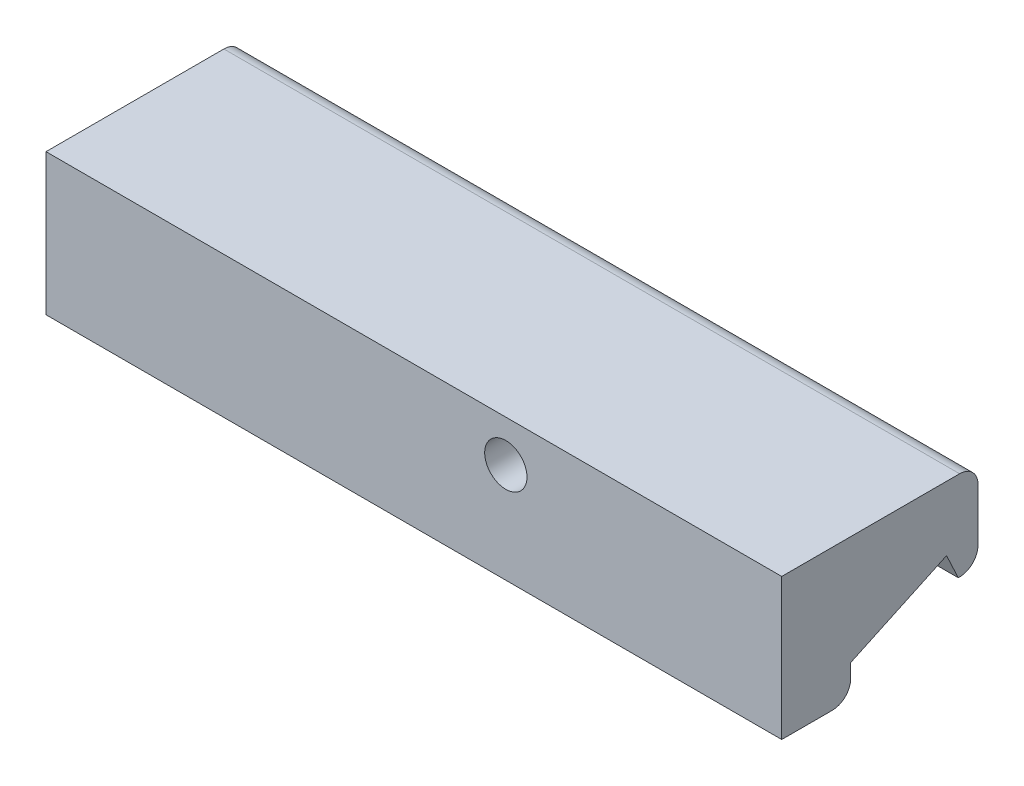
ISO-10303-21;
HEADER;
FILE_DESCRIPTION(('STEP AP214'),'2;1');
FILE_NAME('part.step','',(''),(''),'','','');
FILE_SCHEMA(('AUTOMOTIVE_DESIGN { 1 0 10303 214 1 1 1 1 }'));
ENDSEC;
DATA;
#1=APPLICATION_CONTEXT('core data for automotive mechanical design processes');
#2=APPLICATION_PROTOCOL_DEFINITION('international standard','automotive_design',2000,#1);
#3=PRODUCT_CONTEXT('',#1,'mechanical');
#4=PRODUCT('Part','Part','',(#3));
#5=PRODUCT_RELATED_PRODUCT_CATEGORY('part','',(#4));
#6=PRODUCT_DEFINITION_FORMATION('','',#4);
#7=PRODUCT_DEFINITION_CONTEXT('part definition',#1,'design');
#8=PRODUCT_DEFINITION('design','',#6,#7);
#9=PRODUCT_DEFINITION_SHAPE('','',#8);
#10=(LENGTH_UNIT() NAMED_UNIT(*) SI_UNIT(.MILLI.,.METRE.));
#11=(NAMED_UNIT(*) PLANE_ANGLE_UNIT() SI_UNIT($,.RADIAN.));
#12=(NAMED_UNIT(*) SI_UNIT($,.STERADIAN.) SOLID_ANGLE_UNIT());
#13=UNCERTAINTY_MEASURE_WITH_UNIT(LENGTH_MEASURE(1.E-05),#10,'distance_accuracy_value','');
#14=(GEOMETRIC_REPRESENTATION_CONTEXT(3) GLOBAL_UNCERTAINTY_ASSIGNED_CONTEXT((#13)) GLOBAL_UNIT_ASSIGNED_CONTEXT((#10,
#11,#12)) REPRESENTATION_CONTEXT('',''));
#15=CARTESIAN_POINT('',(0.,0.,0.));
#16=DIRECTION('',(0.,0.,1.));
#17=DIRECTION('',(1.,0.,0.));
#18=AXIS2_PLACEMENT_3D('',#15,#16,#17);
#19=CARTESIAN_POINT('',(80.,15.360110010018,0.));
#20=DIRECTION('',(0.,0.,-1.));
#21=DIRECTION('',(0.,1.,0.));
#22=AXIS2_PLACEMENT_3D('',#19,#20,#21);
#23=PLANE('',#22);
#24=CARTESIAN_POINT('',(50.,10.860110010018,0.));
#25=DIRECTION('',(0.,0.,1.));
#26=DIRECTION('',(1.,0.,0.));
#27=AXIS2_PLACEMENT_3D('',#24,#25,#26);
#28=CIRCLE('',#27,2.3);
#29=CARTESIAN_POINT('',(52.3,10.860110010018,0.));
#30=VERTEX_POINT('',#29);
#31=EDGE_CURVE('E296',#30,#30,#28,.T.);
#32=ORIENTED_EDGE('',*,*,#31,.F.);
#33=EDGE_LOOP('',(#32));
#34=FACE_BOUND('',#33,.T.);
#35=DIRECTION('',(0.,-1.,0.));
#36=VECTOR('',#35,1.);
#37=CARTESIAN_POINT('',(0.,15.360110010018,0.));
#38=LINE('',#37,#36);
#39=CARTESIAN_POINT('',(0.,15.360110010018,0.));
#40=VERTEX_POINT('',#39);
#41=CARTESIAN_POINT('',(0.,0.,0.));
#42=VERTEX_POINT('',#41);
#43=EDGE_CURVE('E153',#40,#42,#38,.T.);
#44=ORIENTED_EDGE('',*,*,#43,.T.);
#45=DIRECTION('',(-1.,0.,0.));
#46=VECTOR('',#45,1.);
#47=CARTESIAN_POINT('',(80.,0.,0.));
#48=LINE('',#47,#46);
#49=CARTESIAN_POINT('',(80.,0.,0.));
#50=VERTEX_POINT('',#49);
#51=EDGE_CURVE('E11',#50,#42,#48,.T.);
#52=ORIENTED_EDGE('',*,*,#51,.F.);
#53=DIRECTION('',(0.,-1.,0.));
#54=VECTOR('',#53,1.);
#55=CARTESIAN_POINT('',(80.,15.360110010018,0.));
#56=LINE('',#55,#54);
#57=CARTESIAN_POINT('',(80.,15.360110010018,0.));
#58=VERTEX_POINT('',#57);
#59=EDGE_CURVE('E172',#58,#50,#56,.T.);
#60=ORIENTED_EDGE('',*,*,#59,.F.);
#61=DIRECTION('',(-1.,0.,0.));
#62=VECTOR('',#61,1.);
#63=CARTESIAN_POINT('',(80.,15.360110010018,0.));
#64=LINE('',#63,#62);
#65=EDGE_CURVE('E149',#58,#40,#64,.T.);
#66=ORIENTED_EDGE('',*,*,#65,.T.);
#67=EDGE_LOOP('',(#44,#52,#60,#66));
#68=FACE_BOUND('',#67,.T.);
#69=ADVANCED_FACE('F39',(#34,#68),#23,.F.);
#70=CARTESIAN_POINT('',(80.,0.,0.));
#71=DIRECTION('',(0.,1.,0.));
#72=DIRECTION('',(0.,0.,1.));
#73=AXIS2_PLACEMENT_3D('',#70,#71,#72);
#74=PLANE('',#73);
#75=DIRECTION('',(0.,0.,-1.));
#76=VECTOR('',#75,1.);
#77=CARTESIAN_POINT('',(0.,0.,0.));
#78=LINE('',#77,#76);
#79=CARTESIAN_POINT('',(0.,0.,-5.4994615533352));
#80=VERTEX_POINT('',#79);
#81=EDGE_CURVE('E156',#42,#80,#78,.T.);
#82=ORIENTED_EDGE('',*,*,#81,.T.);
#83=DIRECTION('',(-1.,0.,0.));
#84=VECTOR('',#83,1.);
#85=CARTESIAN_POINT('',(80.,0.,-5.4994615533352));
#86=LINE('',#85,#84);
#87=CARTESIAN_POINT('',(80.,0.,-5.4994615533352));
#88=VERTEX_POINT('',#87);
#89=EDGE_CURVE('E46',#88,#80,#86,.T.);
#90=ORIENTED_EDGE('',*,*,#89,.F.);
#91=DIRECTION('',(0.,0.,-1.));
#92=VECTOR('',#91,1.);
#93=CARTESIAN_POINT('',(80.,0.,0.));
#94=LINE('',#93,#92);
#95=EDGE_CURVE('E103',#50,#88,#94,.T.);
#96=ORIENTED_EDGE('',*,*,#95,.F.);
#97=ORIENTED_EDGE('',*,*,#51,.T.);
#98=EDGE_LOOP('',(#82,#90,#96,#97));
#99=FACE_BOUND('',#98,.T.);
#100=ADVANCED_FACE('F287',(#99),#74,.F.);
#101=CARTESIAN_POINT('',(80.,2.0005384466648,-5.4994615533352));
#102=DIRECTION('',(-1.,0.,0.));
#103=DIRECTION('',(0.,0.,1.));
#104=AXIS2_PLACEMENT_3D('',#101,#102,#103);
#105=CYLINDRICAL_SURFACE('',#104,2.0005384466648);
#106=CARTESIAN_POINT('',(0.,2.0005384466648,-5.4994615533352));
#107=DIRECTION('',(1.,0.,0.));
#108=DIRECTION('',(0.,0.,-1.));
#109=AXIS2_PLACEMENT_3D('',#106,#107,#108);
#110=CIRCLE('',#109,2.0005384466648);
#111=CARTESIAN_POINT('',(0.,2.0005384466648,-7.5));
#112=VERTEX_POINT('',#111);
#113=EDGE_CURVE('E159',#80,#112,#110,.T.);
#114=ORIENTED_EDGE('',*,*,#113,.T.);
#115=DIRECTION('',(-1.,0.,0.));
#116=VECTOR('',#115,1.);
#117=CARTESIAN_POINT('',(80.,2.0005384466648,-7.5));
#118=LINE('',#117,#116);
#119=CARTESIAN_POINT('',(80.,2.0005384466648,-7.5));
#120=VERTEX_POINT('',#119);
#121=EDGE_CURVE('E185',#120,#112,#118,.T.);
#122=ORIENTED_EDGE('',*,*,#121,.F.);
#123=CARTESIAN_POINT('',(80.,2.0005384466648,-5.4994615533352));
#124=DIRECTION('',(1.,0.,0.));
#125=DIRECTION('',(0.,0.,-1.));
#126=AXIS2_PLACEMENT_3D('',#123,#124,#125);
#127=CIRCLE('',#126,2.0005384466648);
#128=EDGE_CURVE('E193',#88,#120,#127,.T.);
#129=ORIENTED_EDGE('',*,*,#128,.F.);
#130=ORIENTED_EDGE('',*,*,#89,.T.);
#131=EDGE_LOOP('',(#114,#122,#129,#130));
#132=FACE_BOUND('',#131,.T.);
#133=ADVANCED_FACE('F191',(#132),#105,.T.);
#134=CARTESIAN_POINT('',(80.,3.5,-7.5));
#135=DIRECTION('',(0.,0.,1.));
#136=DIRECTION('',(0.,-1.,0.));
#137=AXIS2_PLACEMENT_3D('',#134,#135,#136);
#138=PLANE('',#137);
#139=DIRECTION('',(0.,1.,0.));
#140=VECTOR('',#139,1.);
#141=CARTESIAN_POINT('',(0.,3.5,-7.5));
#142=LINE('',#141,#140);
#143=CARTESIAN_POINT('',(0.,3.5,-7.5));
#144=VERTEX_POINT('',#143);
#145=EDGE_CURVE('E161',#112,#144,#142,.T.);
#146=ORIENTED_EDGE('',*,*,#145,.T.);
#147=DIRECTION('',(-1.,0.,0.));
#148=VECTOR('',#147,1.);
#149=CARTESIAN_POINT('',(0.,3.5,-7.5));
#150=LINE('',#149,#148);
#151=CARTESIAN_POINT('',(28.,3.5,-7.5));
#152=VERTEX_POINT('',#151);
#153=EDGE_CURVE('E207',#152,#144,#150,.T.);
#154=ORIENTED_EDGE('',*,*,#153,.F.);
#155=DIRECTION('',(-1.,0.,0.));
#156=VECTOR('',#155,1.);
#157=CARTESIAN_POINT('',(80.,3.5,-7.5));
#158=LINE('',#157,#156);
#159=CARTESIAN_POINT('',(80.,3.5,-7.5));
#160=VERTEX_POINT('',#159);
#161=EDGE_CURVE('E182',#160,#152,#158,.T.);
#162=ORIENTED_EDGE('',*,*,#161,.F.);
#163=DIRECTION('',(0.,1.,0.));
#164=VECTOR('',#163,1.);
#165=CARTESIAN_POINT('',(80.,3.5,-7.5));
#166=LINE('',#165,#164);
#167=EDGE_CURVE('E260',#120,#160,#166,.T.);
#168=ORIENTED_EDGE('',*,*,#167,.F.);
#169=ORIENTED_EDGE('',*,*,#121,.T.);
#170=EDGE_LOOP('',(#146,#154,#162,#168,#169));
#171=FACE_BOUND('',#170,.T.);
#172=ADVANCED_FACE('F203',(#171),#138,.F.);
#173=CARTESIAN_POINT('',(80.,8.36011001001802,-17.9225395509215));
#174=DIRECTION('',(0.,0.906307787036651,0.422618261740697));
#175=DIRECTION('',(0.,-0.422618261740697,0.906307787036651));
#176=AXIS2_PLACEMENT_3D('',#173,#174,#175);
#177=PLANE('',#176);
#178=CARTESIAN_POINT('',(36.15,5.93005500500901,-12.7112697754607));
#179=DIRECTION('',(0.,-0.906307787036651,-0.422618261740697));
#180=DIRECTION('',(0.,0.422618261740697,-0.906307787036651));
#181=AXIS2_PLACEMENT_3D('',#178,#179,#180);
#182=CIRCLE('',#181,2.30000000000001);
#183=CARTESIAN_POINT('',(36.15,6.90207700701262,-14.7957776856451));
#184=VERTEX_POINT('',#183);
#185=EDGE_CURVE('E251',#184,#184,#182,.T.);
#186=ORIENTED_EDGE('',*,*,#185,.F.);
#187=EDGE_LOOP('',(#186));
#188=FACE_BOUND('',#187,.T.);
#189=ORIENTED_EDGE('',*,*,#161,.T.);
#190=DIRECTION('',(0.,-0.422618261740697,0.906307787036651));
#191=VECTOR('',#190,1.);
#192=CARTESIAN_POINT('',(28.,3.5,-7.5));
#193=LINE('',#192,#191);
#194=CARTESIAN_POINT('',(28.,8.36011001001802,-17.9225395509215));
#195=VERTEX_POINT('',#194);
#196=EDGE_CURVE('E246',#195,#152,#193,.T.);
#197=ORIENTED_EDGE('',*,*,#196,.F.);
#198=DIRECTION('',(-1.,0.,0.));
#199=VECTOR('',#198,1.);
#200=CARTESIAN_POINT('',(80.,8.36011001001802,-17.9225395509215));
#201=LINE('',#200,#199);
#202=CARTESIAN_POINT('',(80.,8.36011001001802,-17.9225395509215));
#203=VERTEX_POINT('',#202);
#204=EDGE_CURVE('E179',#203,#195,#201,.T.);
#205=ORIENTED_EDGE('',*,*,#204,.F.);
#206=DIRECTION('',(0.,0.422618261740697,-0.906307787036651));
#207=VECTOR('',#206,1.);
#208=CARTESIAN_POINT('',(80.,8.36011001001802,-17.9225395509215));
#209=LINE('',#208,#207);
#210=EDGE_CURVE('E262',#160,#203,#209,.T.);
#211=ORIENTED_EDGE('',*,*,#210,.F.);
#212=EDGE_LOOP('',(#189,#197,#205,#211));
#213=FACE_BOUND('',#212,.T.);
#214=ADVANCED_FACE('F275',(#188,#213),#177,.F.);
#215=CARTESIAN_POINT('',(80.,5.64118664890806,-19.1903943361436));
#216=DIRECTION('',(0.,0.422618261740697,-0.906307787036651));
#217=DIRECTION('',(0.,0.906307787036651,0.422618261740697));
#218=AXIS2_PLACEMENT_3D('',#215,#216,#217);
#219=PLANE('',#218);
#220=DIRECTION('',(0.,-0.906307787036651,-0.422618261740697));
#221=VECTOR('',#220,1.);
#222=CARTESIAN_POINT('',(0.,5.64118664890806,-19.1903943361436));
#223=LINE('',#222,#221);
#224=CARTESIAN_POINT('',(0.,14.2511106257563,-15.175520849607));
#225=VERTEX_POINT('',#224);
#226=CARTESIAN_POINT('',(0.,5.64118664890806,-19.1903943361436));
#227=VERTEX_POINT('',#226);
#228=EDGE_CURVE('E164',#225,#227,#223,.T.);
#229=ORIENTED_EDGE('',*,*,#228,.T.);
#230=DIRECTION('',(-1.,0.,0.));
#231=VECTOR('',#230,1.);
#232=CARTESIAN_POINT('',(80.,5.64118664890806,-19.1903943361436));
#233=LINE('',#232,#231);
#234=CARTESIAN_POINT('',(80.,5.64118664890806,-19.1903943361436));
#235=VERTEX_POINT('',#234);
#236=EDGE_CURVE('E176',#235,#227,#233,.T.);
#237=ORIENTED_EDGE('',*,*,#236,.F.);
#238=DIRECTION('',(0.,-0.906307787036651,-0.422618261740697));
#239=VECTOR('',#238,1.);
#240=CARTESIAN_POINT('',(80.,5.64118664890806,-19.1903943361436));
#241=LINE('',#240,#239);
#242=EDGE_CURVE('E264',#203,#235,#241,.T.);
#243=ORIENTED_EDGE('',*,*,#242,.F.);
#244=ORIENTED_EDGE('',*,*,#204,.T.);
#245=DIRECTION('',(0.,-0.906307787036651,-0.422618261740697));
#246=VECTOR('',#245,1.);
#247=CARTESIAN_POINT('',(28.,14.2511106257563,-15.175520849607));
#248=LINE('',#247,#246);
#249=CARTESIAN_POINT('',(28.,14.2511106257563,-15.175520849607));
#250=VERTEX_POINT('',#249);
#251=EDGE_CURVE('E226',#250,#195,#248,.T.);
#252=ORIENTED_EDGE('',*,*,#251,.F.);
#253=DIRECTION('',(1.,0.,0.));
#254=VECTOR('',#253,1.);
#255=CARTESIAN_POINT('',(0.,14.2511106257563,-15.175520849607));
#256=LINE('',#255,#254);
#257=EDGE_CURVE('E230',#225,#250,#256,.T.);
#258=ORIENTED_EDGE('',*,*,#257,.F.);
#259=EDGE_LOOP('',(#229,#237,#243,#244,#252,#258));
#260=FACE_BOUND('',#259,.T.);
#261=ADVANCED_FACE('F228',(#260),#219,.F.);
#262=CARTESIAN_POINT('',(80.,7.63552847711335,-19.3407295358501));
#263=DIRECTION('',(-1.,0.,0.));
#264=DIRECTION('',(0.,0.,1.));
#265=AXIS2_PLACEMENT_3D('',#262,#263,#264);
#266=CYLINDRICAL_SURFACE('',#265,2.);
#267=CARTESIAN_POINT('',(0.,7.63552847711335,-19.3407295358501));
#268=DIRECTION('',(1.,0.,0.));
#269=DIRECTION('',(0.,0.,-1.));
#270=AXIS2_PLACEMENT_3D('',#267,#268,#269);
#271=CIRCLE('',#270,2.);
#272=CARTESIAN_POINT('',(0.,7.63552847711335,-21.3407295358501));
#273=VERTEX_POINT('',#272);
#274=EDGE_CURVE('E166',#227,#273,#271,.T.);
#275=ORIENTED_EDGE('',*,*,#274,.T.);
#276=DIRECTION('',(-1.,0.,0.));
#277=VECTOR('',#276,1.);
#278=CARTESIAN_POINT('',(80.,7.63552847711335,-21.3407295358501));
#279=LINE('',#278,#277);
#280=CARTESIAN_POINT('',(80.,7.63552847711335,-21.3407295358501));
#281=VERTEX_POINT('',#280);
#282=EDGE_CURVE('E144',#281,#273,#279,.T.);
#283=ORIENTED_EDGE('',*,*,#282,.F.);
#284=CARTESIAN_POINT('',(80.,7.63552847711335,-19.3407295358501));
#285=DIRECTION('',(1.,0.,0.));
#286=DIRECTION('',(0.,0.,-1.));
#287=AXIS2_PLACEMENT_3D('',#284,#285,#286);
#288=CIRCLE('',#287,2.);
#289=EDGE_CURVE('E132',#235,#281,#288,.T.);
#290=ORIENTED_EDGE('',*,*,#289,.F.);
#291=ORIENTED_EDGE('',*,*,#236,.T.);
#292=EDGE_LOOP('',(#275,#283,#290,#291));
#293=FACE_BOUND('',#292,.T.);
#294=ADVANCED_FACE('F269',(#293),#266,.T.);
#295=CARTESIAN_POINT('',(80.,7.63552847711335,-21.3407295358501));
#296=DIRECTION('',(0.,0.,1.));
#297=DIRECTION('',(1.,0.,0.));
#298=AXIS2_PLACEMENT_3D('',#295,#296,#297);
#299=PLANE('',#298);
#300=DIRECTION('',(0.,1.,0.));
#301=VECTOR('',#300,1.);
#302=CARTESIAN_POINT('',(0.,7.63552847711335,-21.3407295358501));
#303=LINE('',#302,#301);
#304=CARTESIAN_POINT('',(0.,13.360110010018,-21.3407295358501));
#305=VERTEX_POINT('',#304);
#306=EDGE_CURVE('E141',#273,#305,#303,.T.);
#307=ORIENTED_EDGE('',*,*,#306,.T.);
#308=DIRECTION('',(-1.,0.,0.));
#309=VECTOR('',#308,1.);
#310=CARTESIAN_POINT('',(80.,13.360110010018,-21.3407295358501));
#311=LINE('',#310,#309);
#312=CARTESIAN_POINT('',(80.,13.360110010018,-21.3407295358501));
#313=VERTEX_POINT('',#312);
#314=EDGE_CURVE('E138',#313,#305,#311,.T.);
#315=ORIENTED_EDGE('',*,*,#314,.F.);
#316=DIRECTION('',(0.,1.,0.));
#317=VECTOR('',#316,1.);
#318=CARTESIAN_POINT('',(80.,7.63552847711335,-21.3407295358501));
#319=LINE('',#318,#317);
#320=EDGE_CURVE('E125',#281,#313,#319,.T.);
#321=ORIENTED_EDGE('',*,*,#320,.F.);
#322=ORIENTED_EDGE('',*,*,#282,.T.);
#323=EDGE_LOOP('',(#307,#315,#321,#322));
#324=FACE_BOUND('',#323,.T.);
#325=ADVANCED_FACE('F139',(#324),#299,.F.);
#326=CARTESIAN_POINT('',(80.,13.360110010018,-19.3407295358501));
#327=DIRECTION('',(-1.,0.,0.));
#328=DIRECTION('',(0.,0.,1.));
#329=AXIS2_PLACEMENT_3D('',#326,#327,#328);
#330=CYLINDRICAL_SURFACE('',#329,2.);
#331=CARTESIAN_POINT('',(0.,13.360110010018,-19.3407295358501));
#332=DIRECTION('',(1.,0.,0.));
#333=DIRECTION('',(0.,0.,1.));
#334=AXIS2_PLACEMENT_3D('',#331,#332,#333);
#335=CIRCLE('',#334,2.);
#336=CARTESIAN_POINT('',(0.,15.360110010018,-19.3407295358501));
#337=VERTEX_POINT('',#336);
#338=EDGE_CURVE('E169',#305,#337,#335,.T.);
#339=ORIENTED_EDGE('',*,*,#338,.T.);
#340=DIRECTION('',(-1.,0.,0.));
#341=VECTOR('',#340,1.);
#342=CARTESIAN_POINT('',(80.,15.360110010018,-19.3407295358501));
#343=LINE('',#342,#341);
#344=CARTESIAN_POINT('',(80.,15.360110010018,-19.3407295358501));
#345=VERTEX_POINT('',#344);
#346=EDGE_CURVE('E145',#345,#337,#343,.T.);
#347=ORIENTED_EDGE('',*,*,#346,.F.);
#348=CARTESIAN_POINT('',(80.,13.360110010018,-19.3407295358501));
#349=DIRECTION('',(1.,0.,0.));
#350=DIRECTION('',(0.,0.,1.));
#351=AXIS2_PLACEMENT_3D('',#348,#349,#350);
#352=CIRCLE('',#351,2.);
#353=EDGE_CURVE('E129',#313,#345,#352,.T.);
#354=ORIENTED_EDGE('',*,*,#353,.F.);
#355=ORIENTED_EDGE('',*,*,#314,.T.);
#356=EDGE_LOOP('',(#339,#347,#354,#355));
#357=FACE_BOUND('',#356,.T.);
#358=ADVANCED_FACE('F147',(#357),#330,.T.);
#359=CARTESIAN_POINT('',(80.,15.360110010018,-19.3407295358501));
#360=DIRECTION('',(0.,-1.,0.));
#361=DIRECTION('',(0.,0.,-1.));
#362=AXIS2_PLACEMENT_3D('',#359,#360,#361);
#363=PLANE('',#362);
#364=DIRECTION('',(0.,0.,1.));
#365=VECTOR('',#364,1.);
#366=CARTESIAN_POINT('',(0.,15.360110010018,-19.3407295358501));
#367=LINE('',#366,#365);
#368=EDGE_CURVE('E95',#337,#40,#367,.T.);
#369=ORIENTED_EDGE('',*,*,#368,.T.);
#370=ORIENTED_EDGE('',*,*,#65,.F.);
#371=DIRECTION('',(0.,0.,1.));
#372=VECTOR('',#371,1.);
#373=CARTESIAN_POINT('',(80.,15.360110010018,-19.3407295358501));
#374=LINE('',#373,#372);
#375=EDGE_CURVE('E62',#345,#58,#374,.T.);
#376=ORIENTED_EDGE('',*,*,#375,.F.);
#377=ORIENTED_EDGE('',*,*,#346,.T.);
#378=EDGE_LOOP('',(#369,#370,#376,#377));
#379=FACE_BOUND('',#378,.T.);
#380=ADVANCED_FACE('F270',(#379),#363,.F.);
#381=CARTESIAN_POINT('',(80.,2.0005384466648,-5.4994615533352));
#382=DIRECTION('',(1.,0.,0.));
#383=DIRECTION('',(0.,0.,-1.));
#384=AXIS2_PLACEMENT_3D('',#381,#382,#383);
#385=PLANE('',#384);
#386=ORIENTED_EDGE('',*,*,#59,.T.);
#387=ORIENTED_EDGE('',*,*,#95,.T.);
#388=ORIENTED_EDGE('',*,*,#128,.T.);
#389=ORIENTED_EDGE('',*,*,#167,.T.);
#390=ORIENTED_EDGE('',*,*,#210,.T.);
#391=ORIENTED_EDGE('',*,*,#242,.T.);
#392=ORIENTED_EDGE('',*,*,#289,.T.);
#393=ORIENTED_EDGE('',*,*,#320,.T.);
#394=ORIENTED_EDGE('',*,*,#353,.T.);
#395=ORIENTED_EDGE('',*,*,#375,.T.);
#396=EDGE_LOOP('',(#386,#387,#388,#389,#390,#391,#392,#393,#394,#395));
#397=FACE_BOUND('',#396,.T.);
#398=ADVANCED_FACE('F127',(#397),#385,.T.);
#399=CARTESIAN_POINT('',(0.,2.0005384466648,-5.4994615533352));
#400=DIRECTION('',(1.,0.,0.));
#401=DIRECTION('',(0.,0.,-1.));
#402=AXIS2_PLACEMENT_3D('',#399,#400,#401);
#403=PLANE('',#402);
#404=DIRECTION('',(0.,0.422618261740697,-0.906307787036651));
#405=VECTOR('',#404,1.);
#406=CARTESIAN_POINT('',(0.,9.39100061573824,-4.75298129868547));
#407=LINE('',#406,#405);
#408=CARTESIAN_POINT('',(0.,9.39100061573824,-4.75298129868547));
#409=VERTEX_POINT('',#408);
#410=EDGE_CURVE('E240',#409,#225,#407,.T.);
#411=ORIENTED_EDGE('',*,*,#410,.F.);
#412=DIRECTION('',(0.,-0.906307787036651,-0.422618261740697));
#413=VECTOR('',#412,1.);
#414=CARTESIAN_POINT('',(0.,9.39100061573824,-4.75298129868547));
#415=LINE('',#414,#413);
#416=EDGE_CURVE('E200',#409,#144,#415,.T.);
#417=ORIENTED_EDGE('',*,*,#416,.T.);
#418=ORIENTED_EDGE('',*,*,#145,.F.);
#419=ORIENTED_EDGE('',*,*,#113,.F.);
#420=ORIENTED_EDGE('',*,*,#81,.F.);
#421=ORIENTED_EDGE('',*,*,#43,.F.);
#422=ORIENTED_EDGE('',*,*,#368,.F.);
#423=ORIENTED_EDGE('',*,*,#338,.F.);
#424=ORIENTED_EDGE('',*,*,#306,.F.);
#425=ORIENTED_EDGE('',*,*,#274,.F.);
#426=ORIENTED_EDGE('',*,*,#228,.F.);
#427=EDGE_LOOP('',(#411,#417,#418,#419,#420,#421,#422,#423,#424,#425,#426));
#428=FACE_BOUND('',#427,.T.);
#429=ADVANCED_FACE('F197',(#428),#403,.F.);
#430=CARTESIAN_POINT('',(36.15,10.0084400466739,-10.8094875976276));
#431=DIRECTION('',(0.,-0.906307787036651,-0.422618261740697));
#432=DIRECTION('',(0.,0.422618261740697,-0.906307787036651));
#433=AXIS2_PLACEMENT_3D('',#430,#431,#432);
#434=CYLINDRICAL_SURFACE('',#433,2.30000000000001);
#435=CARTESIAN_POINT('',(36.15,10.0084400466739,-10.8094875976276));
#436=DIRECTION('',(0.,-0.906307787036651,-0.422618261740697));
#437=DIRECTION('',(0.,0.422618261740697,-0.906307787036651));
#438=AXIS2_PLACEMENT_3D('',#435,#436,#437);
#439=CIRCLE('',#438,2.30000000000001);
#440=CARTESIAN_POINT('',(36.15,10.9804620486776,-12.8939955078119));
#441=VERTEX_POINT('',#440);
#442=EDGE_CURVE('E157',#441,#441,#439,.T.);
#443=ORIENTED_EDGE('',*,*,#442,.F.);
#444=EDGE_LOOP('',(#443));
#445=FACE_BOUND('',#444,.T.);
#446=ORIENTED_EDGE('',*,*,#185,.T.);
#447=EDGE_LOOP('',(#446));
#448=FACE_BOUND('',#447,.T.);
#449=ADVANCED_FACE('F320',(#445,#448),#434,.F.);
#450=CARTESIAN_POINT('',(36.15,10.0084400466739,-10.8094875976276));
#451=DIRECTION('',(0.,-0.906307787036651,-0.422618261740697));
#452=DIRECTION('',(0.,0.422618261740697,-0.906307787036651));
#453=AXIS2_PLACEMENT_3D('',#450,#451,#452);
#454=PLANE('',#453);
#455=ORIENTED_EDGE('',*,*,#442,.T.);
#456=EDGE_LOOP('',(#455));
#457=FACE_BOUND('',#456,.T.);
#458=ADVANCED_FACE('F315',(#457),#454,.T.);
#459=CARTESIAN_POINT('',(0.,9.39100061573824,-4.75298129868547));
#460=DIRECTION('',(0.,-0.422618261740697,0.906307787036651));
#461=DIRECTION('',(0.,-0.906307787036651,-0.422618261740697));
#462=AXIS2_PLACEMENT_3D('',#459,#460,#461);
#463=PLANE('',#462);
#464=ORIENTED_EDGE('',*,*,#153,.T.);
#465=ORIENTED_EDGE('',*,*,#416,.F.);
#466=DIRECTION('',(-1.,0.,0.));
#467=VECTOR('',#466,1.);
#468=CARTESIAN_POINT('',(0.,9.39100061573824,-4.75298129868547));
#469=LINE('',#468,#467);
#470=CARTESIAN_POINT('',(28.,9.39100061573824,-4.75298129868547));
#471=VERTEX_POINT('',#470);
#472=EDGE_CURVE('E53',#471,#409,#469,.T.);
#473=ORIENTED_EDGE('',*,*,#472,.F.);
#474=DIRECTION('',(0.,-0.906307787036651,-0.422618261740697));
#475=VECTOR('',#474,1.);
#476=CARTESIAN_POINT('',(28.,9.39100061573824,-4.75298129868547));
#477=LINE('',#476,#475);
#478=EDGE_CURVE('E217',#471,#152,#477,.T.);
#479=ORIENTED_EDGE('',*,*,#478,.T.);
#480=EDGE_LOOP('',(#464,#465,#473,#479));
#481=FACE_BOUND('',#480,.T.);
#482=ADVANCED_FACE('F312',(#481),#463,.F.);
#483=CARTESIAN_POINT('',(28.,9.39100061573824,-4.75298129868547));
#484=DIRECTION('',(1.,0.,0.));
#485=DIRECTION('',(0.,0.,-1.));
#486=AXIS2_PLACEMENT_3D('',#483,#484,#485);
#487=PLANE('',#486);
#488=ORIENTED_EDGE('',*,*,#196,.T.);
#489=ORIENTED_EDGE('',*,*,#478,.F.);
#490=DIRECTION('',(0.,-0.422618261740697,0.906307787036651));
#491=VECTOR('',#490,1.);
#492=CARTESIAN_POINT('',(28.,9.39100061573824,-4.75298129868547));
#493=LINE('',#492,#491);
#494=EDGE_CURVE('E236',#250,#471,#493,.T.);
#495=ORIENTED_EDGE('',*,*,#494,.F.);
#496=ORIENTED_EDGE('',*,*,#251,.T.);
#497=EDGE_LOOP('',(#488,#489,#495,#496));
#498=FACE_BOUND('',#497,.T.);
#499=ADVANCED_FACE('F237',(#498),#487,.F.);
#500=CARTESIAN_POINT('',(0.,5.89321227099353,2.74805001309728));
#501=DIRECTION('',(0.,-0.906307787036651,-0.422618261740697));
#502=DIRECTION('',(0.,0.422618261740697,-0.906307787036651));
#503=AXIS2_PLACEMENT_3D('',#500,#501,#502);
#504=PLANE('',#503);
#505=ORIENTED_EDGE('',*,*,#410,.T.);
#506=ORIENTED_EDGE('',*,*,#257,.T.);
#507=ORIENTED_EDGE('',*,*,#494,.T.);
#508=ORIENTED_EDGE('',*,*,#472,.T.);
#509=EDGE_LOOP('',(#505,#506,#507,#508));
#510=FACE_BOUND('',#509,.T.);
#511=ADVANCED_FACE('F239',(#510),#504,.T.);
#512=CARTESIAN_POINT('',(50.,10.860110010018,-4.5));
#513=DIRECTION('',(0.,0.,1.));
#514=DIRECTION('',(1.,0.,0.));
#515=AXIS2_PLACEMENT_3D('',#512,#513,#514);
#516=CYLINDRICAL_SURFACE('',#515,2.3);
#517=CARTESIAN_POINT('',(50.,10.860110010018,-4.5));
#518=DIRECTION('',(0.,0.,1.));
#519=DIRECTION('',(1.,0.,0.));
#520=AXIS2_PLACEMENT_3D('',#517,#518,#519);
#521=CIRCLE('',#520,2.3);
#522=CARTESIAN_POINT('',(52.3,10.860110010018,-4.5));
#523=VERTEX_POINT('',#522);
#524=EDGE_CURVE('E248',#523,#523,#521,.T.);
#525=ORIENTED_EDGE('',*,*,#524,.F.);
#526=EDGE_LOOP('',(#525));
#527=FACE_BOUND('',#526,.T.);
#528=ORIENTED_EDGE('',*,*,#31,.T.);
#529=EDGE_LOOP('',(#528));
#530=FACE_BOUND('',#529,.T.);
#531=ADVANCED_FACE('F304',(#527,#530),#516,.F.);
#532=CARTESIAN_POINT('',(50.,10.860110010018,-4.5));
#533=DIRECTION('',(0.,0.,1.));
#534=DIRECTION('',(1.,0.,0.));
#535=AXIS2_PLACEMENT_3D('',#532,#533,#534);
#536=PLANE('',#535);
#537=ORIENTED_EDGE('',*,*,#524,.T.);
#538=EDGE_LOOP('',(#537));
#539=FACE_BOUND('',#538,.T.);
#540=ADVANCED_FACE('F302',(#539),#536,.T.);
#541=CLOSED_SHELL('',(#69,#100,#133,#172,#214,#261,#294,#325,#358,#380,#398,#429,#449,#458,#482,
#499,#511,#531,#540));
#542=MANIFOLD_SOLID_BREP('B2',#541);
#543=ADVANCED_BREP_SHAPE_REPRESENTATION('',(#18,#542),#14);
#544=SHAPE_DEFINITION_REPRESENTATION(#9,#543);
ENDSEC;
END-ISO-10303-21;
